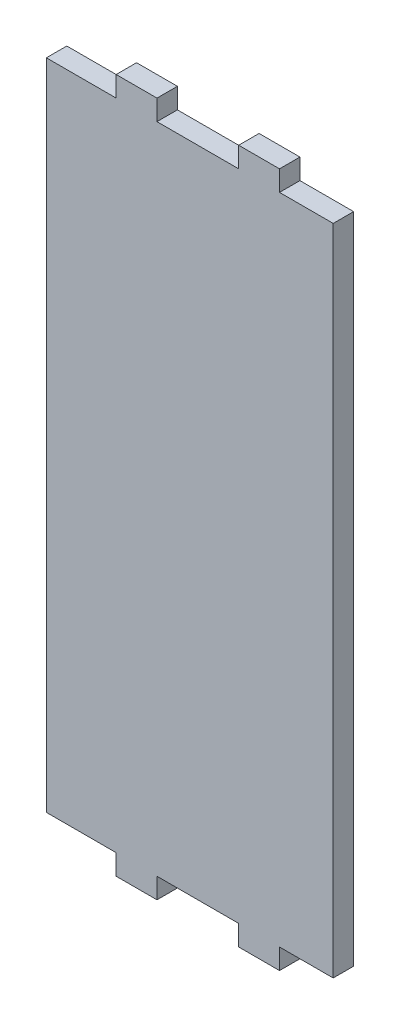
ISO-10303-21;
HEADER;
FILE_DESCRIPTION(('STEP AP214'),'2;1');
FILE_NAME('part.step','',(''),(''),'','','');
FILE_SCHEMA(('AUTOMOTIVE_DESIGN { 1 0 10303 214 1 1 1 1 }'));
ENDSEC;
DATA;
#1=APPLICATION_CONTEXT('core data for automotive mechanical design processes');
#2=APPLICATION_PROTOCOL_DEFINITION('international standard','automotive_design',2000,#1);
#3=PRODUCT_CONTEXT('',#1,'mechanical');
#4=PRODUCT('Part','Part','',(#3));
#5=PRODUCT_RELATED_PRODUCT_CATEGORY('part','',(#4));
#6=PRODUCT_DEFINITION_FORMATION('','',#4);
#7=PRODUCT_DEFINITION_CONTEXT('part definition',#1,'design');
#8=PRODUCT_DEFINITION('design','',#6,#7);
#9=PRODUCT_DEFINITION_SHAPE('','',#8);
#10=(LENGTH_UNIT() NAMED_UNIT(*) SI_UNIT(.MILLI.,.METRE.));
#11=(NAMED_UNIT(*) PLANE_ANGLE_UNIT() SI_UNIT($,.RADIAN.));
#12=(NAMED_UNIT(*) SI_UNIT($,.STERADIAN.) SOLID_ANGLE_UNIT());
#13=UNCERTAINTY_MEASURE_WITH_UNIT(LENGTH_MEASURE(1.E-05),#10,'distance_accuracy_value','');
#14=(GEOMETRIC_REPRESENTATION_CONTEXT(3) GLOBAL_UNCERTAINTY_ASSIGNED_CONTEXT((#13)) GLOBAL_UNIT_ASSIGNED_CONTEXT((#10,
#11,#12)) REPRESENTATION_CONTEXT('',''));
#15=CARTESIAN_POINT('',(0.,0.,0.));
#16=DIRECTION('',(0.,0.,1.));
#17=DIRECTION('',(1.,0.,0.));
#18=AXIS2_PLACEMENT_3D('',#15,#16,#17);
#19=CARTESIAN_POINT('',(-106.249875022113,0.,5.));
#20=DIRECTION('',(1.,0.,0.));
#21=DIRECTION('',(0.,1.,0.));
#22=AXIS2_PLACEMENT_3D('',#19,#20,#21);
#23=PLANE('',#22);
#24=DIRECTION('',(0.,-1.,0.));
#25=VECTOR('',#24,1.);
#26=CARTESIAN_POINT('',(-106.249875022113,0.,0.));
#27=LINE('',#26,#25);
#28=CARTESIAN_POINT('',(-106.249875022113,160.,0.));
#29=VERTEX_POINT('',#28);
#30=CARTESIAN_POINT('',(-106.249875022113,0.,0.));
#31=VERTEX_POINT('',#30);
#32=EDGE_CURVE('E204',#29,#31,#27,.T.);
#33=ORIENTED_EDGE('',*,*,#32,.F.);
#34=DIRECTION('',(0.,0.,-1.));
#35=VECTOR('',#34,1.);
#36=CARTESIAN_POINT('',(-106.249875022113,160.,5.));
#37=LINE('',#36,#35);
#38=CARTESIAN_POINT('',(-106.249875022113,160.,5.));
#39=VERTEX_POINT('',#38);
#40=EDGE_CURVE('E11',#39,#29,#37,.T.);
#41=ORIENTED_EDGE('',*,*,#40,.F.);
#42=DIRECTION('',(0.,-1.,0.));
#43=VECTOR('',#42,1.);
#44=CARTESIAN_POINT('',(-106.249875022113,0.,5.));
#45=LINE('',#44,#43);
#46=CARTESIAN_POINT('',(-106.249875022113,0.,5.));
#47=VERTEX_POINT('',#46);
#48=EDGE_CURVE('E247',#39,#47,#45,.T.);
#49=ORIENTED_EDGE('',*,*,#48,.T.);
#50=DIRECTION('',(0.,0.,-1.));
#51=VECTOR('',#50,1.);
#52=CARTESIAN_POINT('',(-106.249875022113,0.,5.));
#53=LINE('',#52,#51);
#54=EDGE_CURVE('E126',#47,#31,#53,.T.);
#55=ORIENTED_EDGE('',*,*,#54,.T.);
#56=EDGE_LOOP('',(#33,#41,#49,#55));
#57=FACE_BOUND('',#56,.T.);
#58=ADVANCED_FACE('F39',(#57),#23,.T.);
#59=CARTESIAN_POINT('',(0.,160.,5.));
#60=DIRECTION('',(0.,-1.,0.));
#61=DIRECTION('',(0.,0.,-1.));
#62=AXIS2_PLACEMENT_3D('',#59,#60,#61);
#63=PLANE('',#62);
#64=DIRECTION('',(-1.,0.,0.));
#65=VECTOR('',#64,1.);
#66=CARTESIAN_POINT('',(0.,160.,0.));
#67=LINE('',#66,#65);
#68=CARTESIAN_POINT('',(-119.39503941317,160.,0.));
#69=VERTEX_POINT('',#68);
#70=EDGE_CURVE('E207',#29,#69,#67,.T.);
#71=ORIENTED_EDGE('',*,*,#70,.T.);
#72=DIRECTION('',(0.,0.,-1.));
#73=VECTOR('',#72,1.);
#74=CARTESIAN_POINT('',(-119.39503941317,160.,5.));
#75=LINE('',#74,#73);
#76=CARTESIAN_POINT('',(-119.39503941317,160.,5.));
#77=VERTEX_POINT('',#76);
#78=EDGE_CURVE('E47',#77,#69,#75,.T.);
#79=ORIENTED_EDGE('',*,*,#78,.F.);
#80=DIRECTION('',(-1.,0.,0.));
#81=VECTOR('',#80,1.);
#82=CARTESIAN_POINT('',(0.,160.,5.));
#83=LINE('',#82,#81);
#84=EDGE_CURVE('E353',#39,#77,#83,.T.);
#85=ORIENTED_EDGE('',*,*,#84,.F.);
#86=ORIENTED_EDGE('',*,*,#40,.T.);
#87=EDGE_LOOP('',(#71,#79,#85,#86));
#88=FACE_BOUND('',#87,.T.);
#89=ADVANCED_FACE('F356',(#88),#63,.F.);
#90=CARTESIAN_POINT('',(-119.39503941317,0.,5.));
#91=DIRECTION('',(-1.,0.,0.));
#92=DIRECTION('',(0.,0.,1.));
#93=AXIS2_PLACEMENT_3D('',#90,#91,#92);
#94=PLANE('',#93);
#95=DIRECTION('',(0.,1.,0.));
#96=VECTOR('',#95,1.);
#97=CARTESIAN_POINT('',(-119.39503941317,0.,0.));
#98=LINE('',#97,#96);
#99=CARTESIAN_POINT('',(-119.39503941317,165.,0.));
#100=VERTEX_POINT('',#99);
#101=EDGE_CURVE('E209',#69,#100,#98,.T.);
#102=ORIENTED_EDGE('',*,*,#101,.T.);
#103=DIRECTION('',(0.,0.,-1.));
#104=VECTOR('',#103,1.);
#105=CARTESIAN_POINT('',(-119.39503941317,165.,5.));
#106=LINE('',#105,#104);
#107=CARTESIAN_POINT('',(-119.39503941317,165.,5.));
#108=VERTEX_POINT('',#107);
#109=EDGE_CURVE('E286',#108,#100,#106,.T.);
#110=ORIENTED_EDGE('',*,*,#109,.F.);
#111=DIRECTION('',(0.,1.,0.));
#112=VECTOR('',#111,1.);
#113=CARTESIAN_POINT('',(-119.39503941317,0.,5.));
#114=LINE('',#113,#112);
#115=EDGE_CURVE('E295',#77,#108,#114,.T.);
#116=ORIENTED_EDGE('',*,*,#115,.F.);
#117=ORIENTED_EDGE('',*,*,#78,.T.);
#118=EDGE_LOOP('',(#102,#110,#116,#117));
#119=FACE_BOUND('',#118,.T.);
#120=ADVANCED_FACE('F293',(#119),#94,.F.);
#121=CARTESIAN_POINT('',(0.,165.,5.));
#122=DIRECTION('',(0.,-1.,0.));
#123=DIRECTION('',(0.,0.,-1.));
#124=AXIS2_PLACEMENT_3D('',#121,#122,#123);
#125=PLANE('',#124);
#126=DIRECTION('',(-1.,0.,0.));
#127=VECTOR('',#126,1.);
#128=CARTESIAN_POINT('',(0.,165.,0.));
#129=LINE('',#128,#127);
#130=CARTESIAN_POINT('',(-129.39503941317,165.,0.));
#131=VERTEX_POINT('',#130);
#132=EDGE_CURVE('E211',#100,#131,#129,.T.);
#133=ORIENTED_EDGE('',*,*,#132,.T.);
#134=DIRECTION('',(0.,0.,-1.));
#135=VECTOR('',#134,1.);
#136=CARTESIAN_POINT('',(-129.39503941317,165.,5.));
#137=LINE('',#136,#135);
#138=CARTESIAN_POINT('',(-129.39503941317,165.,5.));
#139=VERTEX_POINT('',#138);
#140=EDGE_CURVE('E283',#139,#131,#137,.T.);
#141=ORIENTED_EDGE('',*,*,#140,.F.);
#142=DIRECTION('',(-1.,0.,0.));
#143=VECTOR('',#142,1.);
#144=CARTESIAN_POINT('',(0.,165.,5.));
#145=LINE('',#144,#143);
#146=EDGE_CURVE('E314',#108,#139,#145,.T.);
#147=ORIENTED_EDGE('',*,*,#146,.F.);
#148=ORIENTED_EDGE('',*,*,#109,.T.);
#149=EDGE_LOOP('',(#133,#141,#147,#148));
#150=FACE_BOUND('',#149,.T.);
#151=ADVANCED_FACE('F304',(#150),#125,.F.);
#152=CARTESIAN_POINT('',(-129.39503941317,0.,5.));
#153=DIRECTION('',(1.,0.,0.));
#154=DIRECTION('',(0.,0.,-1.));
#155=AXIS2_PLACEMENT_3D('',#152,#153,#154);
#156=PLANE('',#155);
#157=DIRECTION('',(0.,-1.,0.));
#158=VECTOR('',#157,1.);
#159=CARTESIAN_POINT('',(-129.39503941317,0.,0.));
#160=LINE('',#159,#158);
#161=CARTESIAN_POINT('',(-129.39503941317,160.,0.));
#162=VERTEX_POINT('',#161);
#163=EDGE_CURVE('E213',#131,#162,#160,.T.);
#164=ORIENTED_EDGE('',*,*,#163,.T.);
#165=DIRECTION('',(0.,0.,-1.));
#166=VECTOR('',#165,1.);
#167=CARTESIAN_POINT('',(-129.39503941317,160.,5.));
#168=LINE('',#167,#166);
#169=CARTESIAN_POINT('',(-129.39503941317,160.,5.));
#170=VERTEX_POINT('',#169);
#171=EDGE_CURVE('E281',#170,#162,#168,.T.);
#172=ORIENTED_EDGE('',*,*,#171,.F.);
#173=DIRECTION('',(0.,-1.,0.));
#174=VECTOR('',#173,1.);
#175=CARTESIAN_POINT('',(-129.39503941317,0.,5.));
#176=LINE('',#175,#174);
#177=EDGE_CURVE('E310',#139,#170,#176,.T.);
#178=ORIENTED_EDGE('',*,*,#177,.F.);
#179=ORIENTED_EDGE('',*,*,#140,.T.);
#180=EDGE_LOOP('',(#164,#172,#178,#179));
#181=FACE_BOUND('',#180,.T.);
#182=ADVANCED_FACE('F308',(#181),#156,.F.);
#183=CARTESIAN_POINT('',(0.,160.,5.));
#184=DIRECTION('',(0.,1.,0.));
#185=DIRECTION('',(0.,0.,1.));
#186=AXIS2_PLACEMENT_3D('',#183,#184,#185);
#187=PLANE('',#186);
#188=DIRECTION('',(1.,0.,0.));
#189=VECTOR('',#188,1.);
#190=CARTESIAN_POINT('',(0.,160.,0.));
#191=LINE('',#190,#189);
#192=CARTESIAN_POINT('',(-149.39503941317,160.,0.));
#193=VERTEX_POINT('',#192);
#194=EDGE_CURVE('E216',#193,#162,#191,.T.);
#195=ORIENTED_EDGE('',*,*,#194,.F.);
#196=DIRECTION('',(0.,0.,-1.));
#197=VECTOR('',#196,1.);
#198=CARTESIAN_POINT('',(-149.39503941317,160.,5.));
#199=LINE('',#198,#197);
#200=CARTESIAN_POINT('',(-149.39503941317,160.,5.));
#201=VERTEX_POINT('',#200);
#202=EDGE_CURVE('E279',#201,#193,#199,.T.);
#203=ORIENTED_EDGE('',*,*,#202,.F.);
#204=DIRECTION('',(1.,0.,0.));
#205=VECTOR('',#204,1.);
#206=CARTESIAN_POINT('',(0.,160.,5.));
#207=LINE('',#206,#205);
#208=EDGE_CURVE('E313',#201,#170,#207,.T.);
#209=ORIENTED_EDGE('',*,*,#208,.T.);
#210=ORIENTED_EDGE('',*,*,#171,.T.);
#211=EDGE_LOOP('',(#195,#203,#209,#210));
#212=FACE_BOUND('',#211,.T.);
#213=ADVANCED_FACE('F368',(#212),#187,.T.);
#214=CARTESIAN_POINT('',(-149.39503941317,0.,5.));
#215=DIRECTION('',(-1.,0.,0.));
#216=DIRECTION('',(0.,0.,1.));
#217=AXIS2_PLACEMENT_3D('',#214,#215,#216);
#218=PLANE('',#217);
#219=DIRECTION('',(0.,1.,0.));
#220=VECTOR('',#219,1.);
#221=CARTESIAN_POINT('',(-149.39503941317,0.,0.));
#222=LINE('',#221,#220);
#223=CARTESIAN_POINT('',(-149.39503941317,165.,0.));
#224=VERTEX_POINT('',#223);
#225=EDGE_CURVE('E219',#193,#224,#222,.T.);
#226=ORIENTED_EDGE('',*,*,#225,.T.);
#227=DIRECTION('',(0.,0.,-1.));
#228=VECTOR('',#227,1.);
#229=CARTESIAN_POINT('',(-149.39503941317,165.,5.));
#230=LINE('',#229,#228);
#231=CARTESIAN_POINT('',(-149.39503941317,165.,5.));
#232=VERTEX_POINT('',#231);
#233=EDGE_CURVE('E276',#232,#224,#230,.T.);
#234=ORIENTED_EDGE('',*,*,#233,.F.);
#235=DIRECTION('',(0.,1.,0.));
#236=VECTOR('',#235,1.);
#237=CARTESIAN_POINT('',(-149.39503941317,0.,5.));
#238=LINE('',#237,#236);
#239=EDGE_CURVE('E316',#201,#232,#238,.T.);
#240=ORIENTED_EDGE('',*,*,#239,.F.);
#241=ORIENTED_EDGE('',*,*,#202,.T.);
#242=EDGE_LOOP('',(#226,#234,#240,#241));
#243=FACE_BOUND('',#242,.T.);
#244=ADVANCED_FACE('F371',(#243),#218,.F.);
#245=CARTESIAN_POINT('',(0.,165.,5.));
#246=DIRECTION('',(0.,-1.,0.));
#247=DIRECTION('',(0.,0.,-1.));
#248=AXIS2_PLACEMENT_3D('',#245,#246,#247);
#249=PLANE('',#248);
#250=DIRECTION('',(-1.,0.,0.));
#251=VECTOR('',#250,1.);
#252=CARTESIAN_POINT('',(0.,165.,0.));
#253=LINE('',#252,#251);
#254=CARTESIAN_POINT('',(-159.39503941317,165.,0.));
#255=VERTEX_POINT('',#254);
#256=EDGE_CURVE('E221',#224,#255,#253,.T.);
#257=ORIENTED_EDGE('',*,*,#256,.T.);
#258=DIRECTION('',(0.,0.,-1.));
#259=VECTOR('',#258,1.);
#260=CARTESIAN_POINT('',(-159.39503941317,165.,5.));
#261=LINE('',#260,#259);
#262=CARTESIAN_POINT('',(-159.39503941317,165.,5.));
#263=VERTEX_POINT('',#262);
#264=EDGE_CURVE('E273',#263,#255,#261,.T.);
#265=ORIENTED_EDGE('',*,*,#264,.F.);
#266=DIRECTION('',(-1.,0.,0.));
#267=VECTOR('',#266,1.);
#268=CARTESIAN_POINT('',(0.,165.,5.));
#269=LINE('',#268,#267);
#270=EDGE_CURVE('E322',#232,#263,#269,.T.);
#271=ORIENTED_EDGE('',*,*,#270,.F.);
#272=ORIENTED_EDGE('',*,*,#233,.T.);
#273=EDGE_LOOP('',(#257,#265,#271,#272));
#274=FACE_BOUND('',#273,.T.);
#275=ADVANCED_FACE('F375',(#274),#249,.F.);
#276=CARTESIAN_POINT('',(-159.39503941317,0.,5.));
#277=DIRECTION('',(1.,0.,0.));
#278=DIRECTION('',(0.,0.,-1.));
#279=AXIS2_PLACEMENT_3D('',#276,#277,#278);
#280=PLANE('',#279);
#281=DIRECTION('',(0.,-1.,0.));
#282=VECTOR('',#281,1.);
#283=CARTESIAN_POINT('',(-159.39503941317,0.,0.));
#284=LINE('',#283,#282);
#285=CARTESIAN_POINT('',(-159.39503941317,160.,0.));
#286=VERTEX_POINT('',#285);
#287=EDGE_CURVE('E223',#255,#286,#284,.T.);
#288=ORIENTED_EDGE('',*,*,#287,.T.);
#289=DIRECTION('',(0.,0.,-1.));
#290=VECTOR('',#289,1.);
#291=CARTESIAN_POINT('',(-159.39503941317,160.,5.));
#292=LINE('',#291,#290);
#293=CARTESIAN_POINT('',(-159.39503941317,160.,5.));
#294=VERTEX_POINT('',#293);
#295=EDGE_CURVE('E271',#294,#286,#292,.T.);
#296=ORIENTED_EDGE('',*,*,#295,.F.);
#297=DIRECTION('',(0.,-1.,0.));
#298=VECTOR('',#297,1.);
#299=CARTESIAN_POINT('',(-159.39503941317,0.,5.));
#300=LINE('',#299,#298);
#301=EDGE_CURVE('E324',#263,#294,#300,.T.);
#302=ORIENTED_EDGE('',*,*,#301,.F.);
#303=ORIENTED_EDGE('',*,*,#264,.T.);
#304=EDGE_LOOP('',(#288,#296,#302,#303));
#305=FACE_BOUND('',#304,.T.);
#306=ADVANCED_FACE('F379',(#305),#280,.F.);
#307=CARTESIAN_POINT('',(0.,160.,5.));
#308=DIRECTION('',(0.,1.,0.));
#309=DIRECTION('',(0.,0.,1.));
#310=AXIS2_PLACEMENT_3D('',#307,#308,#309);
#311=PLANE('',#310);
#312=DIRECTION('',(1.,0.,0.));
#313=VECTOR('',#312,1.);
#314=CARTESIAN_POINT('',(0.,160.,0.));
#315=LINE('',#314,#313);
#316=CARTESIAN_POINT('',(-176.476710020683,160.,0.));
#317=VERTEX_POINT('',#316);
#318=EDGE_CURVE('E226',#317,#286,#315,.T.);
#319=ORIENTED_EDGE('',*,*,#318,.F.);
#320=DIRECTION('',(0.,0.,-1.));
#321=VECTOR('',#320,1.);
#322=CARTESIAN_POINT('',(-176.476710020683,160.,5.));
#323=LINE('',#322,#321);
#324=CARTESIAN_POINT('',(-176.476710020683,160.,5.));
#325=VERTEX_POINT('',#324);
#326=EDGE_CURVE('E269',#325,#317,#323,.T.);
#327=ORIENTED_EDGE('',*,*,#326,.F.);
#328=DIRECTION('',(1.,0.,0.));
#329=VECTOR('',#328,1.);
#330=CARTESIAN_POINT('',(0.,160.,5.));
#331=LINE('',#330,#329);
#332=EDGE_CURVE('E326',#325,#294,#331,.T.);
#333=ORIENTED_EDGE('',*,*,#332,.T.);
#334=ORIENTED_EDGE('',*,*,#295,.T.);
#335=EDGE_LOOP('',(#319,#327,#333,#334));
#336=FACE_BOUND('',#335,.T.);
#337=ADVANCED_FACE('F383',(#336),#311,.T.);
#338=CARTESIAN_POINT('',(-176.476710020683,0.,5.));
#339=DIRECTION('',(1.,0.,0.));
#340=DIRECTION('',(0.,0.,-1.));
#341=AXIS2_PLACEMENT_3D('',#338,#339,#340);
#342=PLANE('',#341);
#343=DIRECTION('',(0.,-1.,0.));
#344=VECTOR('',#343,1.);
#345=CARTESIAN_POINT('',(-176.476710020683,0.,0.));
#346=LINE('',#345,#344);
#347=CARTESIAN_POINT('',(-176.476710020683,0.,0.));
#348=VERTEX_POINT('',#347);
#349=EDGE_CURVE('E229',#317,#348,#346,.T.);
#350=ORIENTED_EDGE('',*,*,#349,.T.);
#351=DIRECTION('',(0.,0.,-1.));
#352=VECTOR('',#351,1.);
#353=CARTESIAN_POINT('',(-176.476710020683,0.,5.));
#354=LINE('',#353,#352);
#355=CARTESIAN_POINT('',(-176.476710020683,0.,5.));
#356=VERTEX_POINT('',#355);
#357=EDGE_CURVE('E266',#356,#348,#354,.T.);
#358=ORIENTED_EDGE('',*,*,#357,.F.);
#359=DIRECTION('',(0.,-1.,0.));
#360=VECTOR('',#359,1.);
#361=CARTESIAN_POINT('',(-176.476710020683,0.,5.));
#362=LINE('',#361,#360);
#363=EDGE_CURVE('E329',#325,#356,#362,.T.);
#364=ORIENTED_EDGE('',*,*,#363,.F.);
#365=ORIENTED_EDGE('',*,*,#326,.T.);
#366=EDGE_LOOP('',(#350,#358,#364,#365));
#367=FACE_BOUND('',#366,.T.);
#368=ADVANCED_FACE('F387',(#367),#342,.F.);
#369=CARTESIAN_POINT('',(0.,0.,5.));
#370=DIRECTION('',(0.,1.,0.));
#371=DIRECTION('',(-1.,0.,0.));
#372=AXIS2_PLACEMENT_3D('',#369,#370,#371);
#373=PLANE('',#372);
#374=DIRECTION('',(1.,0.,0.));
#375=VECTOR('',#374,1.);
#376=CARTESIAN_POINT('',(0.,0.,0.));
#377=LINE('',#376,#375);
#378=CARTESIAN_POINT('',(-159.39503941317,0.,0.));
#379=VERTEX_POINT('',#378);
#380=EDGE_CURVE('E231',#348,#379,#377,.T.);
#381=ORIENTED_EDGE('',*,*,#380,.T.);
#382=DIRECTION('',(0.,0.,-1.));
#383=VECTOR('',#382,1.);
#384=CARTESIAN_POINT('',(-159.39503941317,0.,5.));
#385=LINE('',#384,#383);
#386=CARTESIAN_POINT('',(-159.39503941317,0.,5.));
#387=VERTEX_POINT('',#386);
#388=EDGE_CURVE('E263',#387,#379,#385,.T.);
#389=ORIENTED_EDGE('',*,*,#388,.F.);
#390=DIRECTION('',(1.,0.,0.));
#391=VECTOR('',#390,1.);
#392=CARTESIAN_POINT('',(0.,0.,5.));
#393=LINE('',#392,#391);
#394=EDGE_CURVE('E331',#356,#387,#393,.T.);
#395=ORIENTED_EDGE('',*,*,#394,.F.);
#396=ORIENTED_EDGE('',*,*,#357,.T.);
#397=EDGE_LOOP('',(#381,#389,#395,#396));
#398=FACE_BOUND('',#397,.T.);
#399=ADVANCED_FACE('F391',(#398),#373,.F.);
#400=CARTESIAN_POINT('',(-159.39503941317,0.,5.));
#401=DIRECTION('',(1.,0.,0.));
#402=DIRECTION('',(0.,0.,-1.));
#403=AXIS2_PLACEMENT_3D('',#400,#401,#402);
#404=PLANE('',#403);
#405=DIRECTION('',(0.,-1.,0.));
#406=VECTOR('',#405,1.);
#407=CARTESIAN_POINT('',(-159.39503941317,0.,0.));
#408=LINE('',#407,#406);
#409=CARTESIAN_POINT('',(-159.39503941317,-5.,0.));
#410=VERTEX_POINT('',#409);
#411=EDGE_CURVE('E233',#379,#410,#408,.T.);
#412=ORIENTED_EDGE('',*,*,#411,.T.);
#413=DIRECTION('',(0.,0.,-1.));
#414=VECTOR('',#413,1.);
#415=CARTESIAN_POINT('',(-159.39503941317,-5.,5.));
#416=LINE('',#415,#414);
#417=CARTESIAN_POINT('',(-159.39503941317,-5.,5.));
#418=VERTEX_POINT('',#417);
#419=EDGE_CURVE('E260',#418,#410,#416,.T.);
#420=ORIENTED_EDGE('',*,*,#419,.F.);
#421=DIRECTION('',(0.,-1.,0.));
#422=VECTOR('',#421,1.);
#423=CARTESIAN_POINT('',(-159.39503941317,0.,5.));
#424=LINE('',#423,#422);
#425=EDGE_CURVE('E333',#387,#418,#424,.T.);
#426=ORIENTED_EDGE('',*,*,#425,.F.);
#427=ORIENTED_EDGE('',*,*,#388,.T.);
#428=EDGE_LOOP('',(#412,#420,#426,#427));
#429=FACE_BOUND('',#428,.T.);
#430=ADVANCED_FACE('F395',(#429),#404,.F.);
#431=CARTESIAN_POINT('',(0.,-5.,5.));
#432=DIRECTION('',(0.,1.,0.));
#433=DIRECTION('',(0.,0.,1.));
#434=AXIS2_PLACEMENT_3D('',#431,#432,#433);
#435=PLANE('',#434);
#436=DIRECTION('',(1.,0.,0.));
#437=VECTOR('',#436,1.);
#438=CARTESIAN_POINT('',(0.,-5.,0.));
#439=LINE('',#438,#437);
#440=CARTESIAN_POINT('',(-149.39503941317,-5.,0.));
#441=VERTEX_POINT('',#440);
#442=EDGE_CURVE('E235',#410,#441,#439,.T.);
#443=ORIENTED_EDGE('',*,*,#442,.T.);
#444=DIRECTION('',(0.,0.,-1.));
#445=VECTOR('',#444,1.);
#446=CARTESIAN_POINT('',(-149.39503941317,-5.,5.));
#447=LINE('',#446,#445);
#448=CARTESIAN_POINT('',(-149.39503941317,-5.,5.));
#449=VERTEX_POINT('',#448);
#450=EDGE_CURVE('E257',#449,#441,#447,.T.);
#451=ORIENTED_EDGE('',*,*,#450,.F.);
#452=DIRECTION('',(1.,0.,0.));
#453=VECTOR('',#452,1.);
#454=CARTESIAN_POINT('',(0.,-5.,5.));
#455=LINE('',#454,#453);
#456=EDGE_CURVE('E335',#418,#449,#455,.T.);
#457=ORIENTED_EDGE('',*,*,#456,.F.);
#458=ORIENTED_EDGE('',*,*,#419,.T.);
#459=EDGE_LOOP('',(#443,#451,#457,#458));
#460=FACE_BOUND('',#459,.T.);
#461=ADVANCED_FACE('F399',(#460),#435,.F.);
#462=CARTESIAN_POINT('',(-149.39503941317,0.,5.));
#463=DIRECTION('',(-1.,0.,0.));
#464=DIRECTION('',(0.,0.,1.));
#465=AXIS2_PLACEMENT_3D('',#462,#463,#464);
#466=PLANE('',#465);
#467=DIRECTION('',(0.,1.,0.));
#468=VECTOR('',#467,1.);
#469=CARTESIAN_POINT('',(-149.39503941317,0.,0.));
#470=LINE('',#469,#468);
#471=CARTESIAN_POINT('',(-149.39503941317,0.,0.));
#472=VERTEX_POINT('',#471);
#473=EDGE_CURVE('E237',#441,#472,#470,.T.);
#474=ORIENTED_EDGE('',*,*,#473,.T.);
#475=DIRECTION('',(0.,0.,-1.));
#476=VECTOR('',#475,1.);
#477=CARTESIAN_POINT('',(-149.39503941317,0.,5.));
#478=LINE('',#477,#476);
#479=CARTESIAN_POINT('',(-149.39503941317,0.,5.));
#480=VERTEX_POINT('',#479);
#481=EDGE_CURVE('E254',#480,#472,#478,.T.);
#482=ORIENTED_EDGE('',*,*,#481,.F.);
#483=DIRECTION('',(0.,1.,0.));
#484=VECTOR('',#483,1.);
#485=CARTESIAN_POINT('',(-149.39503941317,0.,5.));
#486=LINE('',#485,#484);
#487=EDGE_CURVE('E337',#449,#480,#486,.T.);
#488=ORIENTED_EDGE('',*,*,#487,.F.);
#489=ORIENTED_EDGE('',*,*,#450,.T.);
#490=EDGE_LOOP('',(#474,#482,#488,#489));
#491=FACE_BOUND('',#490,.T.);
#492=ADVANCED_FACE('F403',(#491),#466,.F.);
#493=CARTESIAN_POINT('',(0.,0.,5.));
#494=DIRECTION('',(0.,1.,0.));
#495=DIRECTION('',(0.,0.,1.));
#496=AXIS2_PLACEMENT_3D('',#493,#494,#495);
#497=PLANE('',#496);
#498=DIRECTION('',(1.,0.,0.));
#499=VECTOR('',#498,1.);
#500=CARTESIAN_POINT('',(0.,0.,0.));
#501=LINE('',#500,#499);
#502=CARTESIAN_POINT('',(-129.39503941317,0.,0.));
#503=VERTEX_POINT('',#502);
#504=EDGE_CURVE('E239',#472,#503,#501,.T.);
#505=ORIENTED_EDGE('',*,*,#504,.T.);
#506=DIRECTION('',(0.,0.,-1.));
#507=VECTOR('',#506,1.);
#508=CARTESIAN_POINT('',(-129.39503941317,0.,5.));
#509=LINE('',#508,#507);
#510=CARTESIAN_POINT('',(-129.39503941317,0.,5.));
#511=VERTEX_POINT('',#510);
#512=EDGE_CURVE('E251',#511,#503,#509,.T.);
#513=ORIENTED_EDGE('',*,*,#512,.F.);
#514=DIRECTION('',(1.,0.,0.));
#515=VECTOR('',#514,1.);
#516=CARTESIAN_POINT('',(0.,0.,5.));
#517=LINE('',#516,#515);
#518=EDGE_CURVE('E339',#480,#511,#517,.T.);
#519=ORIENTED_EDGE('',*,*,#518,.F.);
#520=ORIENTED_EDGE('',*,*,#481,.T.);
#521=EDGE_LOOP('',(#505,#513,#519,#520));
#522=FACE_BOUND('',#521,.T.);
#523=ADVANCED_FACE('F345',(#522),#497,.F.);
#524=CARTESIAN_POINT('',(-129.39503941317,0.,5.));
#525=DIRECTION('',(1.,0.,0.));
#526=DIRECTION('',(0.,0.,-1.));
#527=AXIS2_PLACEMENT_3D('',#524,#525,#526);
#528=PLANE('',#527);
#529=DIRECTION('',(0.,-1.,0.));
#530=VECTOR('',#529,1.);
#531=CARTESIAN_POINT('',(-129.39503941317,0.,0.));
#532=LINE('',#531,#530);
#533=CARTESIAN_POINT('',(-129.39503941317,-5.,0.));
#534=VERTEX_POINT('',#533);
#535=EDGE_CURVE('E241',#503,#534,#532,.T.);
#536=ORIENTED_EDGE('',*,*,#535,.T.);
#537=DIRECTION('',(0.,0.,-1.));
#538=VECTOR('',#537,1.);
#539=CARTESIAN_POINT('',(-129.39503941317,-5.,5.));
#540=LINE('',#539,#538);
#541=CARTESIAN_POINT('',(-129.39503941317,-5.,5.));
#542=VERTEX_POINT('',#541);
#543=EDGE_CURVE('E196',#542,#534,#540,.T.);
#544=ORIENTED_EDGE('',*,*,#543,.F.);
#545=DIRECTION('',(0.,-1.,0.));
#546=VECTOR('',#545,1.);
#547=CARTESIAN_POINT('',(-129.39503941317,0.,5.));
#548=LINE('',#547,#546);
#549=EDGE_CURVE('E187',#511,#542,#548,.T.);
#550=ORIENTED_EDGE('',*,*,#549,.F.);
#551=ORIENTED_EDGE('',*,*,#512,.T.);
#552=EDGE_LOOP('',(#536,#544,#550,#551));
#553=FACE_BOUND('',#552,.T.);
#554=ADVANCED_FACE('F349',(#553),#528,.F.);
#555=CARTESIAN_POINT('',(0.,-5.,5.));
#556=DIRECTION('',(0.,1.,0.));
#557=DIRECTION('',(0.,0.,1.));
#558=AXIS2_PLACEMENT_3D('',#555,#556,#557);
#559=PLANE('',#558);
#560=DIRECTION('',(1.,0.,0.));
#561=VECTOR('',#560,1.);
#562=CARTESIAN_POINT('',(0.,-5.,0.));
#563=LINE('',#562,#561);
#564=CARTESIAN_POINT('',(-119.39503941317,-5.,0.));
#565=VERTEX_POINT('',#564);
#566=EDGE_CURVE('E195',#534,#565,#563,.T.);
#567=ORIENTED_EDGE('',*,*,#566,.T.);
#568=DIRECTION('',(0.,0.,-1.));
#569=VECTOR('',#568,1.);
#570=CARTESIAN_POINT('',(-119.39503941317,-5.,5.));
#571=LINE('',#570,#569);
#572=CARTESIAN_POINT('',(-119.39503941317,-5.,5.));
#573=VERTEX_POINT('',#572);
#574=EDGE_CURVE('E192',#573,#565,#571,.T.);
#575=ORIENTED_EDGE('',*,*,#574,.F.);
#576=DIRECTION('',(1.,0.,0.));
#577=VECTOR('',#576,1.);
#578=CARTESIAN_POINT('',(0.,-5.,5.));
#579=LINE('',#578,#577);
#580=EDGE_CURVE('E181',#542,#573,#579,.T.);
#581=ORIENTED_EDGE('',*,*,#580,.F.);
#582=ORIENTED_EDGE('',*,*,#543,.T.);
#583=EDGE_LOOP('',(#567,#575,#581,#582));
#584=FACE_BOUND('',#583,.T.);
#585=ADVANCED_FACE('F193',(#584),#559,.F.);
#586=CARTESIAN_POINT('',(-119.39503941317,0.,5.));
#587=DIRECTION('',(-1.,0.,0.));
#588=DIRECTION('',(0.,0.,1.));
#589=AXIS2_PLACEMENT_3D('',#586,#587,#588);
#590=PLANE('',#589);
#591=DIRECTION('',(0.,1.,0.));
#592=VECTOR('',#591,1.);
#593=CARTESIAN_POINT('',(-119.39503941317,0.,0.));
#594=LINE('',#593,#592);
#595=CARTESIAN_POINT('',(-119.39503941317,0.,0.));
#596=VERTEX_POINT('',#595);
#597=EDGE_CURVE('E119',#565,#596,#594,.T.);
#598=ORIENTED_EDGE('',*,*,#597,.T.);
#599=DIRECTION('',(0.,0.,-1.));
#600=VECTOR('',#599,1.);
#601=CARTESIAN_POINT('',(-119.39503941317,0.,5.));
#602=LINE('',#601,#600);
#603=CARTESIAN_POINT('',(-119.39503941317,0.,5.));
#604=VERTEX_POINT('',#603);
#605=EDGE_CURVE('E197',#604,#596,#602,.T.);
#606=ORIENTED_EDGE('',*,*,#605,.F.);
#607=DIRECTION('',(0.,1.,0.));
#608=VECTOR('',#607,1.);
#609=CARTESIAN_POINT('',(-119.39503941317,0.,5.));
#610=LINE('',#609,#608);
#611=EDGE_CURVE('E185',#573,#604,#610,.T.);
#612=ORIENTED_EDGE('',*,*,#611,.F.);
#613=ORIENTED_EDGE('',*,*,#574,.T.);
#614=EDGE_LOOP('',(#598,#606,#612,#613));
#615=FACE_BOUND('',#614,.T.);
#616=ADVANCED_FACE('F199',(#615),#590,.F.);
#617=CARTESIAN_POINT('',(0.,0.,5.));
#618=DIRECTION('',(0.,1.,0.));
#619=DIRECTION('',(0.,0.,1.));
#620=AXIS2_PLACEMENT_3D('',#617,#618,#619);
#621=PLANE('',#620);
#622=DIRECTION('',(1.,0.,0.));
#623=VECTOR('',#622,1.);
#624=CARTESIAN_POINT('',(0.,0.,0.));
#625=LINE('',#624,#623);
#626=EDGE_CURVE('E245',#596,#31,#625,.T.);
#627=ORIENTED_EDGE('',*,*,#626,.T.);
#628=ORIENTED_EDGE('',*,*,#54,.F.);
#629=DIRECTION('',(1.,0.,0.));
#630=VECTOR('',#629,1.);
#631=CARTESIAN_POINT('',(0.,0.,5.));
#632=LINE('',#631,#630);
#633=EDGE_CURVE('E55',#604,#47,#632,.T.);
#634=ORIENTED_EDGE('',*,*,#633,.F.);
#635=ORIENTED_EDGE('',*,*,#605,.T.);
#636=EDGE_LOOP('',(#627,#628,#634,#635));
#637=FACE_BOUND('',#636,.T.);
#638=ADVANCED_FACE('F352',(#637),#621,.F.);
#639=CARTESIAN_POINT('',(0.,0.,5.));
#640=DIRECTION('',(0.,0.,1.));
#641=DIRECTION('',(1.,0.,0.));
#642=AXIS2_PLACEMENT_3D('',#639,#640,#641);
#643=PLANE('',#642);
#644=ORIENTED_EDGE('',*,*,#48,.F.);
#645=ORIENTED_EDGE('',*,*,#84,.T.);
#646=ORIENTED_EDGE('',*,*,#115,.T.);
#647=ORIENTED_EDGE('',*,*,#146,.T.);
#648=ORIENTED_EDGE('',*,*,#177,.T.);
#649=ORIENTED_EDGE('',*,*,#208,.F.);
#650=ORIENTED_EDGE('',*,*,#239,.T.);
#651=ORIENTED_EDGE('',*,*,#270,.T.);
#652=ORIENTED_EDGE('',*,*,#301,.T.);
#653=ORIENTED_EDGE('',*,*,#332,.F.);
#654=ORIENTED_EDGE('',*,*,#363,.T.);
#655=ORIENTED_EDGE('',*,*,#394,.T.);
#656=ORIENTED_EDGE('',*,*,#425,.T.);
#657=ORIENTED_EDGE('',*,*,#456,.T.);
#658=ORIENTED_EDGE('',*,*,#487,.T.);
#659=ORIENTED_EDGE('',*,*,#518,.T.);
#660=ORIENTED_EDGE('',*,*,#549,.T.);
#661=ORIENTED_EDGE('',*,*,#580,.T.);
#662=ORIENTED_EDGE('',*,*,#611,.T.);
#663=ORIENTED_EDGE('',*,*,#633,.T.);
#664=EDGE_LOOP('',(#644,#645,#646,#647,#648,#649,#650,#651,#652,#653,#654,#655,#656,#657,#658,
#659,#660,#661,#662,#663));
#665=FACE_BOUND('',#664,.T.);
#666=ADVANCED_FACE('F183',(#665),#643,.T.);
#667=CARTESIAN_POINT('',(0.,0.,0.));
#668=DIRECTION('',(0.,0.,1.));
#669=DIRECTION('',(1.,0.,0.));
#670=AXIS2_PLACEMENT_3D('',#667,#668,#669);
#671=PLANE('',#670);
#672=ORIENTED_EDGE('',*,*,#32,.T.);
#673=ORIENTED_EDGE('',*,*,#626,.F.);
#674=ORIENTED_EDGE('',*,*,#597,.F.);
#675=ORIENTED_EDGE('',*,*,#566,.F.);
#676=ORIENTED_EDGE('',*,*,#535,.F.);
#677=ORIENTED_EDGE('',*,*,#504,.F.);
#678=ORIENTED_EDGE('',*,*,#473,.F.);
#679=ORIENTED_EDGE('',*,*,#442,.F.);
#680=ORIENTED_EDGE('',*,*,#411,.F.);
#681=ORIENTED_EDGE('',*,*,#380,.F.);
#682=ORIENTED_EDGE('',*,*,#349,.F.);
#683=ORIENTED_EDGE('',*,*,#318,.T.);
#684=ORIENTED_EDGE('',*,*,#287,.F.);
#685=ORIENTED_EDGE('',*,*,#256,.F.);
#686=ORIENTED_EDGE('',*,*,#225,.F.);
#687=ORIENTED_EDGE('',*,*,#194,.T.);
#688=ORIENTED_EDGE('',*,*,#163,.F.);
#689=ORIENTED_EDGE('',*,*,#132,.F.);
#690=ORIENTED_EDGE('',*,*,#101,.F.);
#691=ORIENTED_EDGE('',*,*,#70,.F.);
#692=EDGE_LOOP('',(#672,#673,#674,#675,#676,#677,#678,#679,#680,#681,#682,#683,#684,#685,#686,
#687,#688,#689,#690,#691));
#693=FACE_BOUND('',#692,.T.);
#694=ADVANCED_FACE('F300',(#693),#671,.F.);
#695=CLOSED_SHELL('',(#58,#89,#120,#151,#182,#213,#244,#275,#306,#337,#368,#399,#430,#461,#492,
#523,#554,#585,#616,#638,#666,#694));
#696=MANIFOLD_SOLID_BREP('B2',#695);
#697=ADVANCED_BREP_SHAPE_REPRESENTATION('',(#18,#696),#14);
#698=SHAPE_DEFINITION_REPRESENTATION(#9,#697);
ENDSEC;
END-ISO-10303-21;
